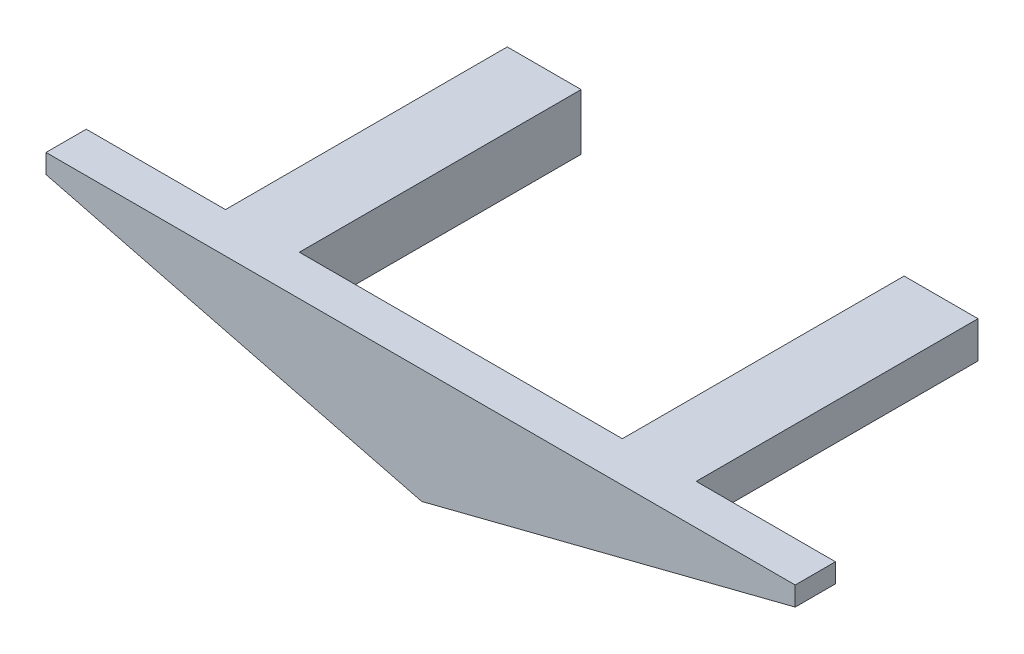
ISO-10303-21;
HEADER;
FILE_DESCRIPTION(('STEP AP214'),'2;1');
FILE_NAME('part.step','',(''),(''),'','','');
FILE_SCHEMA(('AUTOMOTIVE_DESIGN { 1 0 10303 214 1 1 1 1 }'));
ENDSEC;
DATA;
#1=APPLICATION_CONTEXT('core data for automotive mechanical design processes');
#2=APPLICATION_PROTOCOL_DEFINITION('international standard','automotive_design',2000,#1);
#3=PRODUCT_CONTEXT('',#1,'mechanical');
#4=PRODUCT('Part','Part','',(#3));
#5=PRODUCT_RELATED_PRODUCT_CATEGORY('part','',(#4));
#6=PRODUCT_DEFINITION_FORMATION('','',#4);
#7=PRODUCT_DEFINITION_CONTEXT('part definition',#1,'design');
#8=PRODUCT_DEFINITION('design','',#6,#7);
#9=PRODUCT_DEFINITION_SHAPE('','',#8);
#10=(LENGTH_UNIT() NAMED_UNIT(*) SI_UNIT(.MILLI.,.METRE.));
#11=(NAMED_UNIT(*) PLANE_ANGLE_UNIT() SI_UNIT($,.RADIAN.));
#12=(NAMED_UNIT(*) SI_UNIT($,.STERADIAN.) SOLID_ANGLE_UNIT());
#13=UNCERTAINTY_MEASURE_WITH_UNIT(LENGTH_MEASURE(1.E-05),#10,'distance_accuracy_value','');
#14=(GEOMETRIC_REPRESENTATION_CONTEXT(3) GLOBAL_UNCERTAINTY_ASSIGNED_CONTEXT((#13)) GLOBAL_UNIT_ASSIGNED_CONTEXT((#10,
#11,#12)) REPRESENTATION_CONTEXT('',''));
#15=CARTESIAN_POINT('',(0.,0.,0.));
#16=DIRECTION('',(0.,0.,1.));
#17=DIRECTION('',(1.,0.,0.));
#18=AXIS2_PLACEMENT_3D('',#15,#16,#17);
#19=CARTESIAN_POINT('',(0.,0.,0.));
#20=DIRECTION('',(0.,0.,-1.));
#21=DIRECTION('',(-1.,0.,0.));
#22=AXIS2_PLACEMENT_3D('',#19,#20,#21);
#23=PLANE('',#22);
#24=DIRECTION('',(0.967074537262647,0.254493299279643,0.));
#25=VECTOR('',#24,1.);
#26=CARTESIAN_POINT('',(26.0545656629851,-99.0073495193437,0.));
#27=LINE('',#26,#25);
#28=CARTESIAN_POINT('',(20.059825435888,-100.584912737001,0.));
#29=VERTEX_POINT('',#28);
#30=CARTESIAN_POINT('',(29.2357363866948,-98.1701993288938,0.));
#31=VERTEX_POINT('',#30);
#32=EDGE_CURVE('E262',#29,#31,#27,.T.);
#33=ORIENTED_EDGE('',*,*,#32,.T.);
#34=DIRECTION('',(0.,1.,0.));
#35=VECTOR('',#34,1.);
#36=CARTESIAN_POINT('',(29.2357363866946,0.,0.));
#37=LINE('',#36,#35);
#38=CARTESIAN_POINT('',(29.2357363866948,-93.6190708374841,0.));
#39=VERTEX_POINT('',#38);
#40=EDGE_CURVE('E11',#31,#39,#37,.T.);
#41=ORIENTED_EDGE('',*,*,#40,.T.);
#42=DIRECTION('',(-1.,0.,0.));
#43=VECTOR('',#42,1.);
#44=CARTESIAN_POINT('',(-46.5300246540657,-93.6190708374841,0.));
#45=LINE('',#44,#43);
#46=CARTESIAN_POINT('',(46.5300246540657,-93.6190708374841,0.));
#47=VERTEX_POINT('',#46);
#48=EDGE_CURVE('E178',#47,#39,#45,.T.);
#49=ORIENTED_EDGE('',*,*,#48,.F.);
#50=DIRECTION('',(0.,1.,0.));
#51=VECTOR('',#50,1.);
#52=CARTESIAN_POINT('',(46.5300246540657,-95.9993822491319,0.));
#53=LINE('',#52,#51);
#54=CARTESIAN_POINT('',(46.5300246540657,-95.9993822491319,0.));
#55=VERTEX_POINT('',#54);
#56=EDGE_CURVE('E194',#55,#47,#53,.T.);
#57=ORIENTED_EDGE('',*,*,#56,.F.);
#58=DIRECTION('',(0.968981688369931,0.24713253044421,0.));
#59=VECTOR('',#58,1.);
#60=CARTESIAN_POINT('',(46.5300246540657,-95.9993822491319,0.));
#61=LINE('',#60,#59);
#62=CARTESIAN_POINT('',(0.133009642126823,-107.832641703444,0.));
#63=VERTEX_POINT('',#62);
#64=EDGE_CURVE('E191',#63,#55,#61,.T.);
#65=ORIENTED_EDGE('',*,*,#64,.F.);
#66=DIRECTION('',(0.969318279057607,-0.245809019128265,0.));
#67=VECTOR('',#66,1.);
#68=CARTESIAN_POINT('',(0.133009642126823,-107.832641703444,0.));
#69=LINE('',#68,#67);
#70=CARTESIAN_POINT('',(-46.5300246540657,-95.9993822491319,0.));
#71=VERTEX_POINT('',#70);
#72=EDGE_CURVE('E168',#71,#63,#69,.T.);
#73=ORIENTED_EDGE('',*,*,#72,.F.);
#74=DIRECTION('',(0.,-1.,0.));
#75=VECTOR('',#74,1.);
#76=CARTESIAN_POINT('',(-46.5300246540657,-95.9993822491319,0.));
#77=LINE('',#76,#75);
#78=CARTESIAN_POINT('',(-46.5300246540657,-93.6190708374841,0.));
#79=VERTEX_POINT('',#78);
#80=EDGE_CURVE('E163',#79,#71,#77,.T.);
#81=ORIENTED_EDGE('',*,*,#80,.F.);
#82=CARTESIAN_POINT('',(-29.2357363866948,-93.6190708374841,0.));
#83=VERTEX_POINT('',#82);
#84=EDGE_CURVE('E198',#83,#79,#45,.T.);
#85=ORIENTED_EDGE('',*,*,#84,.F.);
#86=DIRECTION('',(0.,1.,0.));
#87=VECTOR('',#86,1.);
#88=CARTESIAN_POINT('',(-29.2357363866948,-93.6190708374841,0.));
#89=LINE('',#88,#87);
#90=CARTESIAN_POINT('',(-29.2357363866948,-98.1701993288938,0.));
#91=VERTEX_POINT('',#90);
#92=EDGE_CURVE('E224',#91,#83,#89,.T.);
#93=ORIENTED_EDGE('',*,*,#92,.F.);
#94=DIRECTION('',(-0.967074537262647,0.254493299279643,0.));
#95=VECTOR('',#94,1.);
#96=CARTESIAN_POINT('',(-29.2357363866948,-98.1701993288938,0.));
#97=LINE('',#96,#95);
#98=CARTESIAN_POINT('',(-20.059825435888,-100.584912737001,0.));
#99=VERTEX_POINT('',#98);
#100=EDGE_CURVE('E69',#99,#91,#97,.T.);
#101=ORIENTED_EDGE('',*,*,#100,.F.);
#102=DIRECTION('',(0.,-1.,0.));
#103=VECTOR('',#102,1.);
#104=CARTESIAN_POINT('',(-20.059825435888,-100.584912737001,0.));
#105=LINE('',#104,#103);
#106=CARTESIAN_POINT('',(-20.059825435888,-93.6190708374841,0.));
#107=VERTEX_POINT('',#106);
#108=EDGE_CURVE('E259',#107,#99,#105,.T.);
#109=ORIENTED_EDGE('',*,*,#108,.F.);
#110=CARTESIAN_POINT('',(20.059825435888,-93.6190708374841,0.));
#111=VERTEX_POINT('',#110);
#112=EDGE_CURVE('E202',#111,#107,#45,.T.);
#113=ORIENTED_EDGE('',*,*,#112,.F.);
#114=DIRECTION('',(0.,-1.,0.));
#115=VECTOR('',#114,1.);
#116=CARTESIAN_POINT('',(20.059825435888,0.,0.));
#117=LINE('',#116,#115);
#118=EDGE_CURVE('E54',#111,#29,#117,.T.);
#119=ORIENTED_EDGE('',*,*,#118,.T.);
#120=EDGE_LOOP('',(#33,#41,#49,#57,#65,#73,#81,#85,#93,#101,#109,#113,#119));
#121=FACE_BOUND('',#120,.T.);
#122=ADVANCED_FACE('F45',(#121),#23,.T.);
#123=CARTESIAN_POINT('',(-20.059825435888,-93.6190708374841,5.00000000000004));
#124=DIRECTION('',(0.,-1.,0.));
#125=DIRECTION('',(0.,0.,-1.));
#126=AXIS2_PLACEMENT_3D('',#123,#124,#125);
#127=PLANE('',#126);
#128=DIRECTION('',(0.,0.,-1.));
#129=VECTOR('',#128,1.);
#130=CARTESIAN_POINT('',(-46.5300246540657,-93.6190708374841,5.));
#131=LINE('',#130,#129);
#132=CARTESIAN_POINT('',(-46.5300246540657,-93.6190708374841,5.));
#133=VERTEX_POINT('',#132);
#134=EDGE_CURVE('E187',#133,#79,#131,.T.);
#135=ORIENTED_EDGE('',*,*,#134,.F.);
#136=DIRECTION('',(-1.,0.,0.));
#137=VECTOR('',#136,1.);
#138=CARTESIAN_POINT('',(-20.059825435888,-93.6190708374841,5.00000000000004));
#139=LINE('',#138,#137);
#140=CARTESIAN_POINT('',(46.5300246540657,-93.6190708374841,5.));
#141=VERTEX_POINT('',#140);
#142=EDGE_CURVE('E229',#141,#133,#139,.T.);
#143=ORIENTED_EDGE('',*,*,#142,.F.);
#144=DIRECTION('',(0.,0.,-1.));
#145=VECTOR('',#144,1.);
#146=CARTESIAN_POINT('',(46.5300246540657,-93.6190708374841,5.));
#147=LINE('',#146,#145);
#148=EDGE_CURVE('E206',#141,#47,#147,.T.);
#149=ORIENTED_EDGE('',*,*,#148,.T.);
#150=ORIENTED_EDGE('',*,*,#48,.T.);
#151=DIRECTION('',(0.,0.,-1.));
#152=VECTOR('',#151,1.);
#153=CARTESIAN_POINT('',(29.2357363866948,-93.6190708374841,5.00000000000004));
#154=LINE('',#153,#152);
#155=CARTESIAN_POINT('',(29.2357363866948,-93.6190708374841,-35.));
#156=VERTEX_POINT('',#155);
#157=EDGE_CURVE('E274',#39,#156,#154,.T.);
#158=ORIENTED_EDGE('',*,*,#157,.T.);
#159=DIRECTION('',(-1.,0.,0.));
#160=VECTOR('',#159,1.);
#161=CARTESIAN_POINT('',(20.059825435888,-93.6190708374841,-35.));
#162=LINE('',#161,#160);
#163=CARTESIAN_POINT('',(20.059825435888,-93.6190708374841,-35.));
#164=VERTEX_POINT('',#163);
#165=EDGE_CURVE('E161',#156,#164,#162,.T.);
#166=ORIENTED_EDGE('',*,*,#165,.T.);
#167=DIRECTION('',(0.,0.,-1.));
#168=VECTOR('',#167,1.);
#169=CARTESIAN_POINT('',(20.059825435888,-93.6190708374841,5.00000000000004));
#170=LINE('',#169,#168);
#171=EDGE_CURVE('E270',#111,#164,#170,.T.);
#172=ORIENTED_EDGE('',*,*,#171,.F.);
#173=ORIENTED_EDGE('',*,*,#112,.T.);
#174=DIRECTION('',(0.,0.,-1.));
#175=VECTOR('',#174,1.);
#176=CARTESIAN_POINT('',(-20.059825435888,-93.6190708374841,5.00000000000004));
#177=LINE('',#176,#175);
#178=CARTESIAN_POINT('',(-20.059825435888,-93.6190708374841,-35.));
#179=VERTEX_POINT('',#178);
#180=EDGE_CURVE('E232',#107,#179,#177,.T.);
#181=ORIENTED_EDGE('',*,*,#180,.T.);
#182=DIRECTION('',(-1.,0.,0.));
#183=VECTOR('',#182,1.);
#184=CARTESIAN_POINT('',(-20.059825435888,-93.6190708374841,-35.));
#185=LINE('',#184,#183);
#186=CARTESIAN_POINT('',(-29.2357363866948,-93.6190708374841,-35.));
#187=VERTEX_POINT('',#186);
#188=EDGE_CURVE('E228',#179,#187,#185,.T.);
#189=ORIENTED_EDGE('',*,*,#188,.T.);
#190=DIRECTION('',(0.,0.,-1.));
#191=VECTOR('',#190,1.);
#192=CARTESIAN_POINT('',(-29.2357363866948,-93.6190708374841,5.00000000000004));
#193=LINE('',#192,#191);
#194=EDGE_CURVE('E256',#83,#187,#193,.T.);
#195=ORIENTED_EDGE('',*,*,#194,.F.);
#196=ORIENTED_EDGE('',*,*,#84,.T.);
#197=EDGE_LOOP('',(#135,#143,#149,#150,#158,#166,#172,#173,#181,#189,#195,#196));
#198=FACE_BOUND('',#197,.T.);
#199=ADVANCED_FACE('F47',(#198),#127,.F.);
#200=CARTESIAN_POINT('',(-29.2357363866948,-93.6190708374841,5.00000000000004));
#201=DIRECTION('',(1.,0.,0.));
#202=DIRECTION('',(0.,1.,0.));
#203=AXIS2_PLACEMENT_3D('',#200,#201,#202);
#204=PLANE('',#203);
#205=DIRECTION('',(0.,0.,-1.));
#206=VECTOR('',#205,1.);
#207=CARTESIAN_POINT('',(-29.2357363866948,-98.1701993288938,5.00000000000004));
#208=LINE('',#207,#206);
#209=CARTESIAN_POINT('',(-29.2357363866948,-98.1701993288938,-35.));
#210=VERTEX_POINT('',#209);
#211=EDGE_CURVE('E253',#91,#210,#208,.T.);
#212=ORIENTED_EDGE('',*,*,#211,.F.);
#213=ORIENTED_EDGE('',*,*,#92,.T.);
#214=ORIENTED_EDGE('',*,*,#194,.T.);
#215=DIRECTION('',(0.,-1.,0.));
#216=VECTOR('',#215,1.);
#217=CARTESIAN_POINT('',(-29.2357363866948,-93.6190708374841,-35.));
#218=LINE('',#217,#216);
#219=EDGE_CURVE('E237',#187,#210,#218,.T.);
#220=ORIENTED_EDGE('',*,*,#219,.T.);
#221=EDGE_LOOP('',(#212,#213,#214,#220));
#222=FACE_BOUND('',#221,.T.);
#223=ADVANCED_FACE('F318',(#222),#204,.F.);
#224=CARTESIAN_POINT('',(-29.2357363866948,-98.1701993288938,5.00000000000004));
#225=DIRECTION('',(0.254493299279643,0.967074537262647,0.));
#226=DIRECTION('',(-0.967074537262647,0.254493299279643,0.));
#227=AXIS2_PLACEMENT_3D('',#224,#225,#226);
#228=PLANE('',#227);
#229=DIRECTION('',(0.,0.,-1.));
#230=VECTOR('',#229,1.);
#231=CARTESIAN_POINT('',(-20.059825435888,-100.584912737001,5.00000000000004));
#232=LINE('',#231,#230);
#233=CARTESIAN_POINT('',(-20.059825435888,-100.584912737001,-35.));
#234=VERTEX_POINT('',#233);
#235=EDGE_CURVE('E250',#99,#234,#232,.T.);
#236=ORIENTED_EDGE('',*,*,#235,.F.);
#237=ORIENTED_EDGE('',*,*,#100,.T.);
#238=ORIENTED_EDGE('',*,*,#211,.T.);
#239=DIRECTION('',(0.967074537262646,-0.254493299279643,0.));
#240=VECTOR('',#239,1.);
#241=CARTESIAN_POINT('',(-29.2357363866948,-98.1701993288938,-35.));
#242=LINE('',#241,#240);
#243=EDGE_CURVE('E241',#210,#234,#242,.T.);
#244=ORIENTED_EDGE('',*,*,#243,.T.);
#245=EDGE_LOOP('',(#236,#237,#238,#244));
#246=FACE_BOUND('',#245,.T.);
#247=ADVANCED_FACE('F400',(#246),#228,.F.);
#248=CARTESIAN_POINT('',(-20.059825435888,-100.584912737001,5.00000000000004));
#249=DIRECTION('',(-1.,0.,0.));
#250=DIRECTION('',(0.,0.,1.));
#251=AXIS2_PLACEMENT_3D('',#248,#249,#250);
#252=PLANE('',#251);
#253=ORIENTED_EDGE('',*,*,#180,.F.);
#254=ORIENTED_EDGE('',*,*,#108,.T.);
#255=ORIENTED_EDGE('',*,*,#235,.T.);
#256=DIRECTION('',(0.,1.,0.));
#257=VECTOR('',#256,1.);
#258=CARTESIAN_POINT('',(-20.059825435888,-100.584912737001,-35.));
#259=LINE('',#258,#257);
#260=EDGE_CURVE('E233',#234,#179,#259,.T.);
#261=ORIENTED_EDGE('',*,*,#260,.T.);
#262=EDGE_LOOP('',(#253,#254,#255,#261));
#263=FACE_BOUND('',#262,.T.);
#264=ADVANCED_FACE('F383',(#263),#252,.F.);
#265=CARTESIAN_POINT('',(0.,0.,5.00000000000004));
#266=DIRECTION('',(0.,0.,1.));
#267=DIRECTION('',(1.,0.,0.));
#268=AXIS2_PLACEMENT_3D('',#265,#266,#267);
#269=PLANE('',#268);
#270=ORIENTED_EDGE('',*,*,#142,.T.);
#271=DIRECTION('',(0.,-1.,0.));
#272=VECTOR('',#271,1.);
#273=CARTESIAN_POINT('',(-46.5300246540657,-95.9993822491319,5.));
#274=LINE('',#273,#272);
#275=CARTESIAN_POINT('',(-46.5300246540657,-95.9993822491319,5.));
#276=VERTEX_POINT('',#275);
#277=EDGE_CURVE('E173',#133,#276,#274,.T.);
#278=ORIENTED_EDGE('',*,*,#277,.T.);
#279=DIRECTION('',(0.969318279057607,-0.245809019128265,0.));
#280=VECTOR('',#279,1.);
#281=CARTESIAN_POINT('',(0.133009642126823,-107.832641703444,5.));
#282=LINE('',#281,#280);
#283=CARTESIAN_POINT('',(0.133009642126823,-107.832641703444,5.));
#284=VERTEX_POINT('',#283);
#285=EDGE_CURVE('E177',#276,#284,#282,.T.);
#286=ORIENTED_EDGE('',*,*,#285,.T.);
#287=DIRECTION('',(0.968981688369931,0.24713253044421,0.));
#288=VECTOR('',#287,1.);
#289=CARTESIAN_POINT('',(46.5300246540657,-95.9993822491319,5.));
#290=LINE('',#289,#288);
#291=CARTESIAN_POINT('',(46.5300246540657,-95.9993822491319,5.));
#292=VERTEX_POINT('',#291);
#293=EDGE_CURVE('E181',#284,#292,#290,.T.);
#294=ORIENTED_EDGE('',*,*,#293,.T.);
#295=DIRECTION('',(0.,1.,0.));
#296=VECTOR('',#295,1.);
#297=CARTESIAN_POINT('',(46.5300246540657,-95.9993822491319,5.));
#298=LINE('',#297,#296);
#299=EDGE_CURVE('E184',#292,#141,#298,.T.);
#300=ORIENTED_EDGE('',*,*,#299,.T.);
#301=EDGE_LOOP('',(#270,#278,#286,#294,#300));
#302=FACE_BOUND('',#301,.T.);
#303=ADVANCED_FACE('F290',(#302),#269,.T.);
#304=CARTESIAN_POINT('',(0.,0.,-35.));
#305=DIRECTION('',(0.,0.,1.));
#306=DIRECTION('',(1.,0.,0.));
#307=AXIS2_PLACEMENT_3D('',#304,#305,#306);
#308=PLANE('',#307);
#309=ORIENTED_EDGE('',*,*,#188,.F.);
#310=ORIENTED_EDGE('',*,*,#260,.F.);
#311=ORIENTED_EDGE('',*,*,#243,.F.);
#312=ORIENTED_EDGE('',*,*,#219,.F.);
#313=EDGE_LOOP('',(#309,#310,#311,#312));
#314=FACE_BOUND('',#313,.T.);
#315=ADVANCED_FACE('F302',(#314),#308,.F.);
#316=CARTESIAN_POINT('',(-46.5300246540657,-95.9993822491319,5.));
#317=DIRECTION('',(1.,0.,0.));
#318=DIRECTION('',(0.,0.,-1.));
#319=AXIS2_PLACEMENT_3D('',#316,#317,#318);
#320=PLANE('',#319);
#321=ORIENTED_EDGE('',*,*,#80,.T.);
#322=DIRECTION('',(0.,0.,-1.));
#323=VECTOR('',#322,1.);
#324=CARTESIAN_POINT('',(-46.5300246540657,-95.9993822491319,5.));
#325=LINE('',#324,#323);
#326=EDGE_CURVE('E218',#276,#71,#325,.T.);
#327=ORIENTED_EDGE('',*,*,#326,.F.);
#328=ORIENTED_EDGE('',*,*,#277,.F.);
#329=ORIENTED_EDGE('',*,*,#134,.T.);
#330=EDGE_LOOP('',(#321,#327,#328,#329));
#331=FACE_BOUND('',#330,.T.);
#332=ADVANCED_FACE('F300',(#331),#320,.F.);
#333=CARTESIAN_POINT('',(0.133009642126823,-107.832641703444,5.));
#334=DIRECTION('',(0.245809019128265,0.969318279057607,0.));
#335=DIRECTION('',(-0.969318279057607,0.245809019128265,0.));
#336=AXIS2_PLACEMENT_3D('',#333,#334,#335);
#337=PLANE('',#336);
#338=ORIENTED_EDGE('',*,*,#72,.T.);
#339=DIRECTION('',(0.,0.,-1.));
#340=VECTOR('',#339,1.);
#341=CARTESIAN_POINT('',(0.133009642126823,-107.832641703444,5.));
#342=LINE('',#341,#340);
#343=EDGE_CURVE('E214',#284,#63,#342,.T.);
#344=ORIENTED_EDGE('',*,*,#343,.F.);
#345=ORIENTED_EDGE('',*,*,#285,.F.);
#346=ORIENTED_EDGE('',*,*,#326,.T.);
#347=EDGE_LOOP('',(#338,#344,#345,#346));
#348=FACE_BOUND('',#347,.T.);
#349=ADVANCED_FACE('F298',(#348),#337,.F.);
#350=CARTESIAN_POINT('',(46.5300246540657,-95.9993822491319,5.));
#351=DIRECTION('',(-0.247132530444211,0.968981688369931,0.));
#352=DIRECTION('',(-0.968981688369931,-0.247132530444211,0.));
#353=AXIS2_PLACEMENT_3D('',#350,#351,#352);
#354=PLANE('',#353);
#355=ORIENTED_EDGE('',*,*,#64,.T.);
#356=DIRECTION('',(0.,0.,-1.));
#357=VECTOR('',#356,1.);
#358=CARTESIAN_POINT('',(46.5300246540657,-95.9993822491319,5.));
#359=LINE('',#358,#357);
#360=EDGE_CURVE('E210',#292,#55,#359,.T.);
#361=ORIENTED_EDGE('',*,*,#360,.F.);
#362=ORIENTED_EDGE('',*,*,#293,.F.);
#363=ORIENTED_EDGE('',*,*,#343,.T.);
#364=EDGE_LOOP('',(#355,#361,#362,#363));
#365=FACE_BOUND('',#364,.T.);
#366=ADVANCED_FACE('F294',(#365),#354,.F.);
#367=CARTESIAN_POINT('',(46.5300246540657,-95.9993822491319,5.));
#368=DIRECTION('',(-1.,0.,0.));
#369=DIRECTION('',(0.,0.,1.));
#370=AXIS2_PLACEMENT_3D('',#367,#368,#369);
#371=PLANE('',#370);
#372=ORIENTED_EDGE('',*,*,#56,.T.);
#373=ORIENTED_EDGE('',*,*,#148,.F.);
#374=ORIENTED_EDGE('',*,*,#299,.F.);
#375=ORIENTED_EDGE('',*,*,#360,.T.);
#376=EDGE_LOOP('',(#372,#373,#374,#375));
#377=FACE_BOUND('',#376,.T.);
#378=ADVANCED_FACE('F285',(#377),#371,.F.);
#379=CARTESIAN_POINT('',(29.2357363866948,-93.6190708374841,5.00000000000004));
#380=DIRECTION('',(-1.,0.,0.));
#381=DIRECTION('',(0.,-1.,0.));
#382=AXIS2_PLACEMENT_3D('',#379,#380,#381);
#383=PLANE('',#382);
#384=ORIENTED_EDGE('',*,*,#40,.F.);
#385=DIRECTION('',(0.,0.,-1.));
#386=VECTOR('',#385,1.);
#387=CARTESIAN_POINT('',(29.2357363866948,-98.1701993288938,5.00000000000004));
#388=LINE('',#387,#386);
#389=CARTESIAN_POINT('',(29.2357363866948,-98.1701993288938,-35.));
#390=VERTEX_POINT('',#389);
#391=EDGE_CURVE('E61',#31,#390,#388,.T.);
#392=ORIENTED_EDGE('',*,*,#391,.T.);
#393=DIRECTION('',(0.,1.,0.));
#394=VECTOR('',#393,1.);
#395=CARTESIAN_POINT('',(29.2357363866948,-93.6190708374841,-35.));
#396=LINE('',#395,#394);
#397=EDGE_CURVE('E143',#390,#156,#396,.T.);
#398=ORIENTED_EDGE('',*,*,#397,.T.);
#399=ORIENTED_EDGE('',*,*,#157,.F.);
#400=EDGE_LOOP('',(#384,#392,#398,#399));
#401=FACE_BOUND('',#400,.T.);
#402=ADVANCED_FACE('F141',(#401),#383,.F.);
#403=CARTESIAN_POINT('',(20.059825435888,-100.584912737001,5.00000000000004));
#404=DIRECTION('',(1.,0.,0.));
#405=DIRECTION('',(0.,0.,-1.));
#406=AXIS2_PLACEMENT_3D('',#403,#404,#405);
#407=PLANE('',#406);
#408=ORIENTED_EDGE('',*,*,#118,.F.);
#409=ORIENTED_EDGE('',*,*,#171,.T.);
#410=DIRECTION('',(0.,-1.,0.));
#411=VECTOR('',#410,1.);
#412=CARTESIAN_POINT('',(20.059825435888,-100.584912737001,-35.));
#413=LINE('',#412,#411);
#414=CARTESIAN_POINT('',(20.059825435888,-100.584912737001,-35.));
#415=VERTEX_POINT('',#414);
#416=EDGE_CURVE('E156',#164,#415,#413,.T.);
#417=ORIENTED_EDGE('',*,*,#416,.T.);
#418=DIRECTION('',(0.,0.,-1.));
#419=VECTOR('',#418,1.);
#420=CARTESIAN_POINT('',(20.059825435888,-100.584912737001,5.00000000000004));
#421=LINE('',#420,#419);
#422=EDGE_CURVE('E147',#29,#415,#421,.T.);
#423=ORIENTED_EDGE('',*,*,#422,.F.);
#424=EDGE_LOOP('',(#408,#409,#417,#423));
#425=FACE_BOUND('',#424,.T.);
#426=ADVANCED_FACE('F269',(#425),#407,.F.);
#427=CARTESIAN_POINT('',(29.2357363866948,-98.1701993288938,5.00000000000004));
#428=DIRECTION('',(-0.254493299279643,0.967074537262647,0.));
#429=DIRECTION('',(-0.967074537262647,-0.254493299279643,0.));
#430=AXIS2_PLACEMENT_3D('',#427,#428,#429);
#431=PLANE('',#430);
#432=ORIENTED_EDGE('',*,*,#32,.F.);
#433=ORIENTED_EDGE('',*,*,#422,.T.);
#434=DIRECTION('',(0.967074537262646,0.254493299279643,0.));
#435=VECTOR('',#434,1.);
#436=CARTESIAN_POINT('',(29.2357363866948,-98.1701993288938,-35.));
#437=LINE('',#436,#435);
#438=EDGE_CURVE('E146',#415,#390,#437,.T.);
#439=ORIENTED_EDGE('',*,*,#438,.T.);
#440=ORIENTED_EDGE('',*,*,#391,.F.);
#441=EDGE_LOOP('',(#432,#433,#439,#440));
#442=FACE_BOUND('',#441,.T.);
#443=ADVANCED_FACE('F150',(#442),#431,.F.);
#444=CARTESIAN_POINT('',(0.,0.,-35.));
#445=DIRECTION('',(0.,0.,1.));
#446=DIRECTION('',(1.,0.,0.));
#447=AXIS2_PLACEMENT_3D('',#444,#445,#446);
#448=PLANE('',#447);
#449=ORIENTED_EDGE('',*,*,#397,.F.);
#450=ORIENTED_EDGE('',*,*,#438,.F.);
#451=ORIENTED_EDGE('',*,*,#416,.F.);
#452=ORIENTED_EDGE('',*,*,#165,.F.);
#453=EDGE_LOOP('',(#449,#450,#451,#452));
#454=FACE_BOUND('',#453,.T.);
#455=ADVANCED_FACE('F159',(#454),#448,.F.);
#456=CLOSED_SHELL('',(#122,#199,#223,#247,#264,#303,#315,#332,#349,#366,#378,#402,#426,#443,#455));
#457=MANIFOLD_SOLID_BREP('B2',#456);
#458=ADVANCED_BREP_SHAPE_REPRESENTATION('',(#18,#457),#14);
#459=SHAPE_DEFINITION_REPRESENTATION(#9,#458);
ENDSEC;
END-ISO-10303-21;
